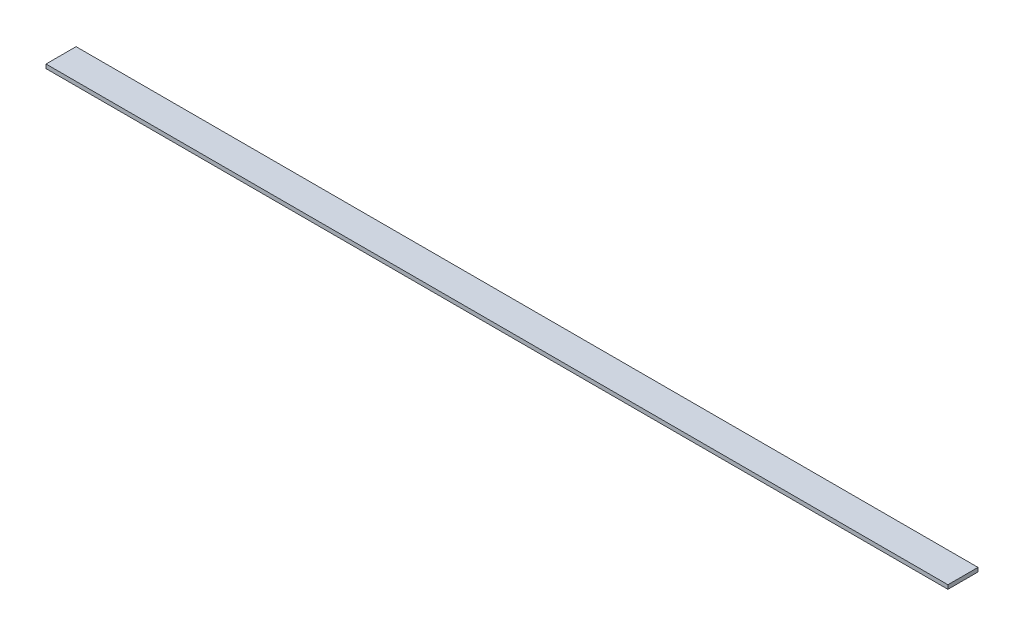
ISO-10303-21;
HEADER;
FILE_DESCRIPTION(('STEP AP214'),'2;1');
FILE_NAME('part.step','',(''),(''),'','','');
FILE_SCHEMA(('AUTOMOTIVE_DESIGN { 1 0 10303 214 1 1 1 1 }'));
ENDSEC;
DATA;
#1=APPLICATION_CONTEXT('core data for automotive mechanical design processes');
#2=APPLICATION_PROTOCOL_DEFINITION('international standard','automotive_design',2000,#1);
#3=PRODUCT_CONTEXT('',#1,'mechanical');
#4=PRODUCT('Part','Part','',(#3));
#5=PRODUCT_RELATED_PRODUCT_CATEGORY('part','',(#4));
#6=PRODUCT_DEFINITION_FORMATION('','',#4);
#7=PRODUCT_DEFINITION_CONTEXT('part definition',#1,'design');
#8=PRODUCT_DEFINITION('design','',#6,#7);
#9=PRODUCT_DEFINITION_SHAPE('','',#8);
#10=(LENGTH_UNIT() NAMED_UNIT(*) SI_UNIT(.MILLI.,.METRE.));
#11=(NAMED_UNIT(*) PLANE_ANGLE_UNIT() SI_UNIT($,.RADIAN.));
#12=(NAMED_UNIT(*) SI_UNIT($,.STERADIAN.) SOLID_ANGLE_UNIT());
#13=UNCERTAINTY_MEASURE_WITH_UNIT(LENGTH_MEASURE(1.E-05),#10,'distance_accuracy_value','');
#14=(GEOMETRIC_REPRESENTATION_CONTEXT(3) GLOBAL_UNCERTAINTY_ASSIGNED_CONTEXT((#13)) GLOBAL_UNIT_ASSIGNED_CONTEXT((#10,
#11,#12)) REPRESENTATION_CONTEXT('',''));
#15=CARTESIAN_POINT('',(0.,0.,0.));
#16=DIRECTION('',(0.,0.,1.));
#17=DIRECTION('',(1.,0.,0.));
#18=AXIS2_PLACEMENT_3D('',#15,#16,#17);
#19=CARTESIAN_POINT('',(2250.,20.,-75.));
#20=DIRECTION('',(-1.,0.,0.));
#21=DIRECTION('',(0.,0.,1.));
#22=AXIS2_PLACEMENT_3D('',#19,#20,#21);
#23=PLANE('',#22);
#24=DIRECTION('',(0.,0.,-1.));
#25=VECTOR('',#24,1.);
#26=CARTESIAN_POINT('',(2250.,0.,-75.));
#27=LINE('',#26,#25);
#28=CARTESIAN_POINT('',(2250.,0.,75.));
#29=VERTEX_POINT('',#28);
#30=CARTESIAN_POINT('',(2250.,0.,-75.));
#31=VERTEX_POINT('',#30);
#32=EDGE_CURVE('E95',#29,#31,#27,.T.);
#33=ORIENTED_EDGE('',*,*,#32,.T.);
#34=DIRECTION('',(0.,-1.,0.));
#35=VECTOR('',#34,1.);
#36=CARTESIAN_POINT('',(2250.,20.,-75.));
#37=LINE('',#36,#35);
#38=CARTESIAN_POINT('',(2250.,20.,-75.));
#39=VERTEX_POINT('',#38);
#40=EDGE_CURVE('E11',#39,#31,#37,.T.);
#41=ORIENTED_EDGE('',*,*,#40,.F.);
#42=DIRECTION('',(0.,0.,-1.));
#43=VECTOR('',#42,1.);
#44=CARTESIAN_POINT('',(2250.,20.,-75.));
#45=LINE('',#44,#43);
#46=CARTESIAN_POINT('',(2250.,20.,75.));
#47=VERTEX_POINT('',#46);
#48=EDGE_CURVE('E83',#47,#39,#45,.T.);
#49=ORIENTED_EDGE('',*,*,#48,.F.);
#50=DIRECTION('',(0.,-1.,0.));
#51=VECTOR('',#50,1.);
#52=CARTESIAN_POINT('',(2250.,20.,75.));
#53=LINE('',#52,#51);
#54=EDGE_CURVE('E91',#47,#29,#53,.T.);
#55=ORIENTED_EDGE('',*,*,#54,.T.);
#56=EDGE_LOOP('',(#33,#41,#49,#55));
#57=FACE_BOUND('',#56,.T.);
#58=ADVANCED_FACE('F32',(#57),#23,.F.);
#59=CARTESIAN_POINT('',(-2250.,20.,-75.));
#60=DIRECTION('',(0.,0.,1.));
#61=DIRECTION('',(1.,0.,0.));
#62=AXIS2_PLACEMENT_3D('',#59,#60,#61);
#63=PLANE('',#62);
#64=DIRECTION('',(-1.,0.,0.));
#65=VECTOR('',#64,1.);
#66=CARTESIAN_POINT('',(-2250.,0.,-75.));
#67=LINE('',#66,#65);
#68=CARTESIAN_POINT('',(-2250.,0.,-75.));
#69=VERTEX_POINT('',#68);
#70=EDGE_CURVE('E87',#31,#69,#67,.T.);
#71=ORIENTED_EDGE('',*,*,#70,.T.);
#72=DIRECTION('',(0.,-1.,0.));
#73=VECTOR('',#72,1.);
#74=CARTESIAN_POINT('',(-2250.,20.,-75.));
#75=LINE('',#74,#73);
#76=CARTESIAN_POINT('',(-2250.,20.,-75.));
#77=VERTEX_POINT('',#76);
#78=EDGE_CURVE('E40',#77,#69,#75,.T.);
#79=ORIENTED_EDGE('',*,*,#78,.F.);
#80=DIRECTION('',(-1.,0.,0.));
#81=VECTOR('',#80,1.);
#82=CARTESIAN_POINT('',(-2250.,20.,-75.));
#83=LINE('',#82,#81);
#84=EDGE_CURVE('E78',#39,#77,#83,.T.);
#85=ORIENTED_EDGE('',*,*,#84,.F.);
#86=ORIENTED_EDGE('',*,*,#40,.T.);
#87=EDGE_LOOP('',(#71,#79,#85,#86));
#88=FACE_BOUND('',#87,.T.);
#89=ADVANCED_FACE('F86',(#88),#63,.F.);
#90=CARTESIAN_POINT('',(-2250.,20.,-75.));
#91=DIRECTION('',(1.,0.,0.));
#92=DIRECTION('',(0.,0.,-1.));
#93=AXIS2_PLACEMENT_3D('',#90,#91,#92);
#94=PLANE('',#93);
#95=DIRECTION('',(0.,0.,1.));
#96=VECTOR('',#95,1.);
#97=CARTESIAN_POINT('',(-2250.,0.,-75.));
#98=LINE('',#97,#96);
#99=CARTESIAN_POINT('',(-2250.,0.,75.));
#100=VERTEX_POINT('',#99);
#101=EDGE_CURVE('E65',#69,#100,#98,.T.);
#102=ORIENTED_EDGE('',*,*,#101,.T.);
#103=DIRECTION('',(0.,-1.,0.));
#104=VECTOR('',#103,1.);
#105=CARTESIAN_POINT('',(-2250.,20.,75.));
#106=LINE('',#105,#104);
#107=CARTESIAN_POINT('',(-2250.,20.,75.));
#108=VERTEX_POINT('',#107);
#109=EDGE_CURVE('E88',#108,#100,#106,.T.);
#110=ORIENTED_EDGE('',*,*,#109,.F.);
#111=DIRECTION('',(0.,0.,1.));
#112=VECTOR('',#111,1.);
#113=CARTESIAN_POINT('',(-2250.,20.,-75.));
#114=LINE('',#113,#112);
#115=EDGE_CURVE('E81',#77,#108,#114,.T.);
#116=ORIENTED_EDGE('',*,*,#115,.F.);
#117=ORIENTED_EDGE('',*,*,#78,.T.);
#118=EDGE_LOOP('',(#102,#110,#116,#117));
#119=FACE_BOUND('',#118,.T.);
#120=ADVANCED_FACE('F89',(#119),#94,.F.);
#121=CARTESIAN_POINT('',(-2250.,20.,75.));
#122=DIRECTION('',(0.,0.,-1.));
#123=DIRECTION('',(-1.,0.,0.));
#124=AXIS2_PLACEMENT_3D('',#121,#122,#123);
#125=PLANE('',#124);
#126=DIRECTION('',(1.,0.,0.));
#127=VECTOR('',#126,1.);
#128=CARTESIAN_POINT('',(-2250.,0.,75.));
#129=LINE('',#128,#127);
#130=EDGE_CURVE('E71',#100,#29,#129,.T.);
#131=ORIENTED_EDGE('',*,*,#130,.T.);
#132=ORIENTED_EDGE('',*,*,#54,.F.);
#133=DIRECTION('',(1.,0.,0.));
#134=VECTOR('',#133,1.);
#135=CARTESIAN_POINT('',(-2250.,20.,75.));
#136=LINE('',#135,#134);
#137=EDGE_CURVE('E48',#108,#47,#136,.T.);
#138=ORIENTED_EDGE('',*,*,#137,.F.);
#139=ORIENTED_EDGE('',*,*,#109,.T.);
#140=EDGE_LOOP('',(#131,#132,#138,#139));
#141=FACE_BOUND('',#140,.T.);
#142=ADVANCED_FACE('F102',(#141),#125,.F.);
#143=CARTESIAN_POINT('',(2250.,20.,75.));
#144=DIRECTION('',(0.,1.,0.));
#145=DIRECTION('',(0.,0.,1.));
#146=AXIS2_PLACEMENT_3D('',#143,#144,#145);
#147=PLANE('',#146);
#148=ORIENTED_EDGE('',*,*,#48,.T.);
#149=ORIENTED_EDGE('',*,*,#84,.T.);
#150=ORIENTED_EDGE('',*,*,#115,.T.);
#151=ORIENTED_EDGE('',*,*,#137,.T.);
#152=EDGE_LOOP('',(#148,#149,#150,#151));
#153=FACE_BOUND('',#152,.T.);
#154=ADVANCED_FACE('F79',(#153),#147,.T.);
#155=CARTESIAN_POINT('',(2250.,0.,75.));
#156=DIRECTION('',(0.,1.,0.));
#157=DIRECTION('',(0.,0.,1.));
#158=AXIS2_PLACEMENT_3D('',#155,#156,#157);
#159=PLANE('',#158);
#160=ORIENTED_EDGE('',*,*,#32,.F.);
#161=ORIENTED_EDGE('',*,*,#130,.F.);
#162=ORIENTED_EDGE('',*,*,#101,.F.);
#163=ORIENTED_EDGE('',*,*,#70,.F.);
#164=EDGE_LOOP('',(#160,#161,#162,#163));
#165=FACE_BOUND('',#164,.T.);
#166=ADVANCED_FACE('F105',(#165),#159,.F.);
#167=CLOSED_SHELL('',(#58,#89,#120,#142,#154,#166));
#168=MANIFOLD_SOLID_BREP('B2',#167);
#169=ADVANCED_BREP_SHAPE_REPRESENTATION('',(#18,#168),#14);
#170=SHAPE_DEFINITION_REPRESENTATION(#9,#169);
ENDSEC;
END-ISO-10303-21;
